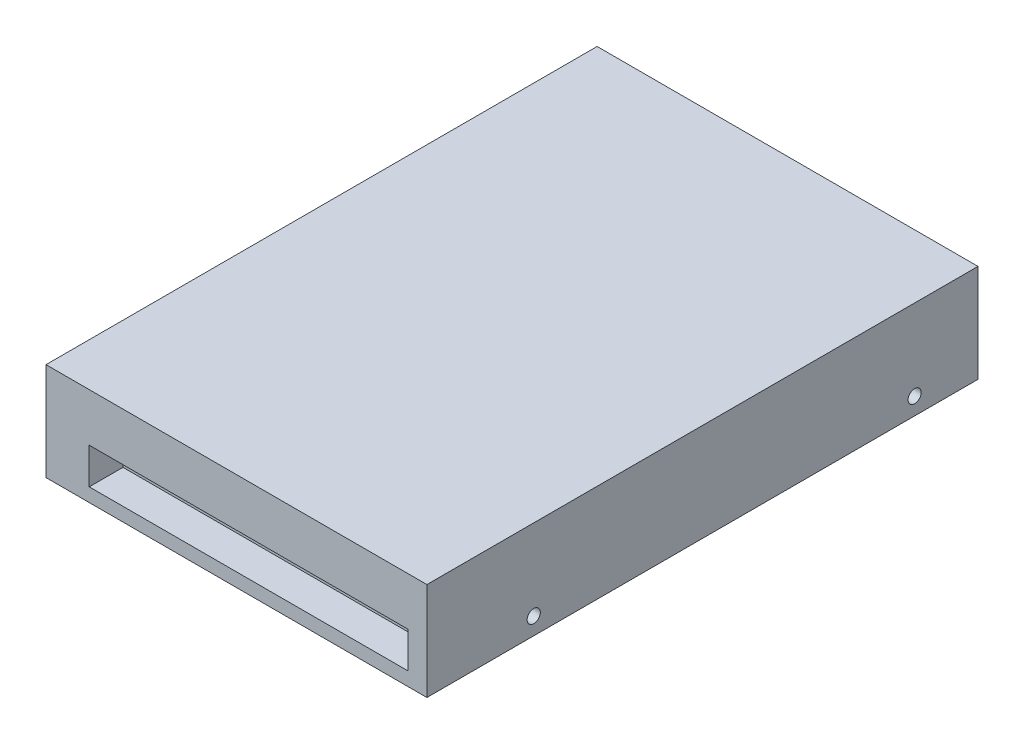
ISO-10303-21;
HEADER;
FILE_DESCRIPTION(('STEP AP214'),'2;1');
FILE_NAME('part.step','',(''),(''),'','','');
FILE_SCHEMA(('AUTOMOTIVE_DESIGN { 1 0 10303 214 1 1 1 1 }'));
ENDSEC;
DATA;
#1=APPLICATION_CONTEXT('core data for automotive mechanical design processes');
#2=APPLICATION_PROTOCOL_DEFINITION('international standard','automotive_design',2000,#1);
#3=PRODUCT_CONTEXT('',#1,'mechanical');
#4=PRODUCT('Part','Part','',(#3));
#5=PRODUCT_RELATED_PRODUCT_CATEGORY('part','',(#4));
#6=PRODUCT_DEFINITION_FORMATION('','',#4);
#7=PRODUCT_DEFINITION_CONTEXT('part definition',#1,'design');
#8=PRODUCT_DEFINITION('design','',#6,#7);
#9=PRODUCT_DEFINITION_SHAPE('','',#8);
#10=(LENGTH_UNIT() NAMED_UNIT(*) SI_UNIT(.MILLI.,.METRE.));
#11=(NAMED_UNIT(*) PLANE_ANGLE_UNIT() SI_UNIT($,.RADIAN.));
#12=(NAMED_UNIT(*) SI_UNIT($,.STERADIAN.) SOLID_ANGLE_UNIT());
#13=UNCERTAINTY_MEASURE_WITH_UNIT(LENGTH_MEASURE(1.E-05),#10,'distance_accuracy_value','');
#14=(GEOMETRIC_REPRESENTATION_CONTEXT(3) GLOBAL_UNCERTAINTY_ASSIGNED_CONTEXT((#13)) GLOBAL_UNIT_ASSIGNED_CONTEXT((#10,
#11,#12)) REPRESENTATION_CONTEXT('',''));
#15=CARTESIAN_POINT('',(0.,0.,0.));
#16=DIRECTION('',(0.,0.,1.));
#17=DIRECTION('',(1.,0.,0.));
#18=AXIS2_PLACEMENT_3D('',#15,#16,#17);
#19=CARTESIAN_POINT('',(50.8,26.1,73.5));
#20=DIRECTION('',(-1.,0.,0.));
#21=DIRECTION('',(0.,0.,1.));
#22=AXIS2_PLACEMENT_3D('',#19,#20,#21);
#23=PLANE('',#22);
#24=CARTESIAN_POINT('',(50.8,4.56739564827879,45.));
#25=DIRECTION('',(-1.,0.,0.));
#26=DIRECTION('',(0.,0.,1.));
#27=AXIS2_PLACEMENT_3D('',#24,#25,#26);
#28=CIRCLE('',#27,1.7526);
#29=CARTESIAN_POINT('',(50.8,4.56739564827879,46.7526));
#30=VERTEX_POINT('',#29);
#31=EDGE_CURVE('E201',#30,#30,#28,.T.);
#32=ORIENTED_EDGE('',*,*,#31,.T.);
#33=EDGE_LOOP('',(#32));
#34=FACE_BOUND('',#33,.T.);
#35=DIRECTION('',(0.,0.,-1.));
#36=VECTOR('',#35,1.);
#37=CARTESIAN_POINT('',(50.8,0.,73.5));
#38=LINE('',#37,#36);
#39=CARTESIAN_POINT('',(50.8,0.,73.5));
#40=VERTEX_POINT('',#39);
#41=CARTESIAN_POINT('',(50.8,0.,-73.5));
#42=VERTEX_POINT('',#41);
#43=EDGE_CURVE('E162',#40,#42,#38,.T.);
#44=ORIENTED_EDGE('',*,*,#43,.T.);
#45=DIRECTION('',(0.,-1.,0.));
#46=VECTOR('',#45,1.);
#47=CARTESIAN_POINT('',(50.8,26.1,-73.5));
#48=LINE('',#47,#46);
#49=CARTESIAN_POINT('',(50.8,26.1,-73.5));
#50=VERTEX_POINT('',#49);
#51=EDGE_CURVE('E166',#50,#42,#48,.T.);
#52=ORIENTED_EDGE('',*,*,#51,.F.);
#53=DIRECTION('',(0.,0.,-1.));
#54=VECTOR('',#53,1.);
#55=CARTESIAN_POINT('',(50.8,26.1,73.5));
#56=LINE('',#55,#54);
#57=CARTESIAN_POINT('',(50.8,26.1,73.5));
#58=VERTEX_POINT('',#57);
#59=EDGE_CURVE('E154',#58,#50,#56,.T.);
#60=ORIENTED_EDGE('',*,*,#59,.F.);
#61=DIRECTION('',(0.,-1.,0.));
#62=VECTOR('',#61,1.);
#63=CARTESIAN_POINT('',(50.8,26.1,73.5));
#64=LINE('',#63,#62);
#65=EDGE_CURVE('E42',#58,#40,#64,.T.);
#66=ORIENTED_EDGE('',*,*,#65,.T.);
#67=EDGE_LOOP('',(#44,#52,#60,#66));
#68=FACE_BOUND('',#67,.T.);
#69=CARTESIAN_POINT('',(50.8,4.56739564827879,-56.6));
#70=DIRECTION('',(-1.,0.,0.));
#71=DIRECTION('',(0.,0.,1.));
#72=AXIS2_PLACEMENT_3D('',#69,#70,#71);
#73=CIRCLE('',#72,1.7526);
#74=CARTESIAN_POINT('',(50.8,4.56739564827879,-54.8474));
#75=VERTEX_POINT('',#74);
#76=EDGE_CURVE('E210',#75,#75,#73,.T.);
#77=ORIENTED_EDGE('',*,*,#76,.T.);
#78=EDGE_LOOP('',(#77));
#79=FACE_BOUND('',#78,.T.);
#80=ADVANCED_FACE('F34',(#34,#68,#79),#23,.F.);
#81=CARTESIAN_POINT('',(-50.8,0.,-73.5));
#82=DIRECTION('',(0.,-1.,0.));
#83=DIRECTION('',(0.,0.,-1.));
#84=AXIS2_PLACEMENT_3D('',#81,#82,#83);
#85=PLANE('',#84);
#86=CARTESIAN_POINT('',(47.62,0.,-12.23));
#87=DIRECTION('',(0.,1.,0.));
#88=DIRECTION('',(0.,0.,-1.));
#89=AXIS2_PLACEMENT_3D('',#86,#87,#88);
#90=CIRCLE('',#89,1.7526);
#91=CARTESIAN_POINT('',(47.62,0.,-13.9826));
#92=VERTEX_POINT('',#91);
#93=EDGE_CURVE('E217',#92,#92,#90,.T.);
#94=ORIENTED_EDGE('',*,*,#93,.T.);
#95=EDGE_LOOP('',(#94));
#96=FACE_BOUND('',#95,.T.);
#97=DIRECTION('',(0.,0.,1.));
#98=VECTOR('',#97,1.);
#99=CARTESIAN_POINT('',(-50.8,0.,73.5));
#100=LINE('',#99,#98);
#101=CARTESIAN_POINT('',(-50.8,0.,-73.5));
#102=VERTEX_POINT('',#101);
#103=CARTESIAN_POINT('',(-50.8,0.,73.5));
#104=VERTEX_POINT('',#103);
#105=EDGE_CURVE('E147',#102,#104,#100,.T.);
#106=ORIENTED_EDGE('',*,*,#105,.F.);
#107=DIRECTION('',(-1.,0.,0.));
#108=VECTOR('',#107,1.);
#109=CARTESIAN_POINT('',(-50.8,0.,-73.5));
#110=LINE('',#109,#108);
#111=EDGE_CURVE('E79',#42,#102,#110,.T.);
#112=ORIENTED_EDGE('',*,*,#111,.F.);
#113=ORIENTED_EDGE('',*,*,#43,.F.);
#114=DIRECTION('',(1.,0.,0.));
#115=VECTOR('',#114,1.);
#116=CARTESIAN_POINT('',(-50.8,0.,73.5));
#117=LINE('',#116,#115);
#118=EDGE_CURVE('E160',#104,#40,#117,.T.);
#119=ORIENTED_EDGE('',*,*,#118,.F.);
#120=EDGE_LOOP('',(#106,#112,#113,#119));
#121=FACE_BOUND('',#120,.T.);
#122=CARTESIAN_POINT('',(-47.62,0.,32.22));
#123=DIRECTION('',(0.,-1.,0.));
#124=DIRECTION('',(0.,0.,-1.));
#125=AXIS2_PLACEMENT_3D('',#122,#123,#124);
#126=CIRCLE('',#125,1.7526);
#127=CARTESIAN_POINT('',(-47.62,0.,30.4674));
#128=VERTEX_POINT('',#127);
#129=EDGE_CURVE('E134',#128,#128,#126,.T.);
#130=ORIENTED_EDGE('',*,*,#129,.F.);
#131=EDGE_LOOP('',(#130));
#132=FACE_BOUND('',#131,.T.);
#133=CARTESIAN_POINT('',(-47.62,0.,-12.23));
#134=DIRECTION('',(0.,-1.,0.));
#135=DIRECTION('',(0.,0.,-1.));
#136=AXIS2_PLACEMENT_3D('',#133,#134,#135);
#137=CIRCLE('',#136,1.7526);
#138=CARTESIAN_POINT('',(-47.62,0.,-13.9826));
#139=VERTEX_POINT('',#138);
#140=EDGE_CURVE('E247',#139,#139,#137,.T.);
#141=ORIENTED_EDGE('',*,*,#140,.F.);
#142=EDGE_LOOP('',(#141));
#143=FACE_BOUND('',#142,.T.);
#144=CARTESIAN_POINT('',(-47.62,0.,-43.98));
#145=DIRECTION('',(0.,-1.,0.));
#146=DIRECTION('',(0.,0.,-1.));
#147=AXIS2_PLACEMENT_3D('',#144,#145,#146);
#148=CIRCLE('',#147,1.7526);
#149=CARTESIAN_POINT('',(-47.62,0.,-45.7326));
#150=VERTEX_POINT('',#149);
#151=EDGE_CURVE('E241',#150,#150,#148,.T.);
#152=ORIENTED_EDGE('',*,*,#151,.F.);
#153=EDGE_LOOP('',(#152));
#154=FACE_BOUND('',#153,.T.);
#155=CARTESIAN_POINT('',(47.62,0.,32.22));
#156=DIRECTION('',(0.,1.,0.));
#157=DIRECTION('',(0.,0.,-1.));
#158=AXIS2_PLACEMENT_3D('',#155,#156,#157);
#159=CIRCLE('',#158,1.7526);
#160=CARTESIAN_POINT('',(47.62,0.,30.4674));
#161=VERTEX_POINT('',#160);
#162=EDGE_CURVE('E223',#161,#161,#159,.T.);
#163=ORIENTED_EDGE('',*,*,#162,.T.);
#164=EDGE_LOOP('',(#163));
#165=FACE_BOUND('',#164,.T.);
#166=CARTESIAN_POINT('',(47.62,0.,-43.98));
#167=DIRECTION('',(0.,1.,0.));
#168=DIRECTION('',(0.,0.,-1.));
#169=AXIS2_PLACEMENT_3D('',#166,#167,#168);
#170=CIRCLE('',#169,1.7526);
#171=CARTESIAN_POINT('',(47.62,0.,-45.7326));
#172=VERTEX_POINT('',#171);
#173=EDGE_CURVE('E207',#172,#172,#170,.T.);
#174=ORIENTED_EDGE('',*,*,#173,.T.);
#175=EDGE_LOOP('',(#174));
#176=FACE_BOUND('',#175,.T.);
#177=ADVANCED_FACE('F175',(#96,#121,#132,#143,#154,#165,#176),#85,.T.);
#178=CARTESIAN_POINT('',(-50.8,26.1,73.5));
#179=DIRECTION('',(1.,0.,0.));
#180=DIRECTION('',(0.,0.,-1.));
#181=AXIS2_PLACEMENT_3D('',#178,#179,#180);
#182=PLANE('',#181);
#183=CARTESIAN_POINT('',(-50.8,4.56739564827879,-56.6));
#184=DIRECTION('',(-1.,0.,0.));
#185=DIRECTION('',(0.,0.,1.));
#186=AXIS2_PLACEMENT_3D('',#183,#184,#185);
#187=CIRCLE('',#186,1.7526);
#188=CARTESIAN_POINT('',(-50.8,4.56739564827879,-54.8474));
#189=VERTEX_POINT('',#188);
#190=EDGE_CURVE('E229',#189,#189,#187,.T.);
#191=ORIENTED_EDGE('',*,*,#190,.F.);
#192=EDGE_LOOP('',(#191));
#193=FACE_BOUND('',#192,.T.);
#194=CARTESIAN_POINT('',(-50.8,4.56739564827879,45.));
#195=DIRECTION('',(-1.,0.,0.));
#196=DIRECTION('',(0.,0.,1.));
#197=AXIS2_PLACEMENT_3D('',#194,#195,#196);
#198=CIRCLE('',#197,1.7526);
#199=CARTESIAN_POINT('',(-50.8,4.56739564827879,46.7526));
#200=VERTEX_POINT('',#199);
#201=EDGE_CURVE('E235',#200,#200,#198,.T.);
#202=ORIENTED_EDGE('',*,*,#201,.F.);
#203=EDGE_LOOP('',(#202));
#204=FACE_BOUND('',#203,.T.);
#205=ORIENTED_EDGE('',*,*,#105,.T.);
#206=DIRECTION('',(0.,-1.,0.));
#207=VECTOR('',#206,1.);
#208=CARTESIAN_POINT('',(-50.8,26.1,73.5));
#209=LINE('',#208,#207);
#210=CARTESIAN_POINT('',(-50.8,26.1,73.5));
#211=VERTEX_POINT('',#210);
#212=EDGE_CURVE('E11',#211,#104,#209,.T.);
#213=ORIENTED_EDGE('',*,*,#212,.F.);
#214=DIRECTION('',(0.,0.,1.));
#215=VECTOR('',#214,1.);
#216=CARTESIAN_POINT('',(-50.8,26.1,73.5));
#217=LINE('',#216,#215);
#218=CARTESIAN_POINT('',(-50.8,26.1,-73.5));
#219=VERTEX_POINT('',#218);
#220=EDGE_CURVE('E151',#219,#211,#217,.T.);
#221=ORIENTED_EDGE('',*,*,#220,.F.);
#222=DIRECTION('',(0.,-1.,0.));
#223=VECTOR('',#222,1.);
#224=CARTESIAN_POINT('',(-50.8,26.1,-73.5));
#225=LINE('',#224,#223);
#226=EDGE_CURVE('E157',#219,#102,#225,.T.);
#227=ORIENTED_EDGE('',*,*,#226,.T.);
#228=EDGE_LOOP('',(#205,#213,#221,#227));
#229=FACE_BOUND('',#228,.T.);
#230=ADVANCED_FACE('F36',(#193,#204,#229),#182,.F.);
#231=CARTESIAN_POINT('',(-50.8,26.1,73.5));
#232=DIRECTION('',(0.,0.,-1.));
#233=DIRECTION('',(-1.,0.,0.));
#234=AXIS2_PLACEMENT_3D('',#231,#232,#233);
#235=PLANE('',#234);
#236=DIRECTION('',(1.,0.,0.));
#237=VECTOR('',#236,1.);
#238=CARTESIAN_POINT('',(-39.268212057209,3.63745397373805,73.5));
#239=LINE('',#238,#237);
#240=CARTESIAN_POINT('',(-39.268212057209,3.63745397373805,73.5));
#241=VERTEX_POINT('',#240);
#242=CARTESIAN_POINT('',(45.7945777667987,3.63745397373805,73.5));
#243=VERTEX_POINT('',#242);
#244=EDGE_CURVE('E140',#241,#243,#239,.T.);
#245=ORIENTED_EDGE('',*,*,#244,.F.);
#246=DIRECTION('',(0.,-1.,0.));
#247=VECTOR('',#246,1.);
#248=CARTESIAN_POINT('',(-39.268212057209,3.63745397373805,73.5));
#249=LINE('',#248,#247);
#250=CARTESIAN_POINT('',(-39.268212057209,13.2595497600505,73.5));
#251=VERTEX_POINT('',#250);
#252=EDGE_CURVE('E49',#251,#241,#249,.T.);
#253=ORIENTED_EDGE('',*,*,#252,.F.);
#254=DIRECTION('',(-1.,0.,0.));
#255=VECTOR('',#254,1.);
#256=CARTESIAN_POINT('',(-39.268212057209,13.2595497600505,73.5));
#257=LINE('',#256,#255);
#258=CARTESIAN_POINT('',(45.7945777667987,13.2595497600505,73.5));
#259=VERTEX_POINT('',#258);
#260=EDGE_CURVE('E128',#259,#251,#257,.T.);
#261=ORIENTED_EDGE('',*,*,#260,.F.);
#262=DIRECTION('',(0.,1.,0.));
#263=VECTOR('',#262,1.);
#264=CARTESIAN_POINT('',(45.7945777667987,3.63745397373805,73.5));
#265=LINE('',#264,#263);
#266=EDGE_CURVE('E131',#243,#259,#265,.T.);
#267=ORIENTED_EDGE('',*,*,#266,.F.);
#268=EDGE_LOOP('',(#245,#253,#261,#267));
#269=FACE_BOUND('',#268,.T.);
#270=ORIENTED_EDGE('',*,*,#118,.T.);
#271=ORIENTED_EDGE('',*,*,#65,.F.);
#272=DIRECTION('',(1.,0.,0.));
#273=VECTOR('',#272,1.);
#274=CARTESIAN_POINT('',(-50.8,26.1,73.5));
#275=LINE('',#274,#273);
#276=EDGE_CURVE('E86',#211,#58,#275,.T.);
#277=ORIENTED_EDGE('',*,*,#276,.F.);
#278=ORIENTED_EDGE('',*,*,#212,.T.);
#279=EDGE_LOOP('',(#270,#271,#277,#278));
#280=FACE_BOUND('',#279,.T.);
#281=ADVANCED_FACE('F183',(#269,#280),#235,.F.);
#282=CARTESIAN_POINT('',(-50.8,26.1,-73.5));
#283=DIRECTION('',(0.,0.,1.));
#284=DIRECTION('',(1.,0.,0.));
#285=AXIS2_PLACEMENT_3D('',#282,#283,#284);
#286=PLANE('',#285);
#287=ORIENTED_EDGE('',*,*,#111,.T.);
#288=ORIENTED_EDGE('',*,*,#226,.F.);
#289=DIRECTION('',(-1.,0.,0.));
#290=VECTOR('',#289,1.);
#291=CARTESIAN_POINT('',(-50.8,26.1,-73.5));
#292=LINE('',#291,#290);
#293=EDGE_CURVE('E58',#50,#219,#292,.T.);
#294=ORIENTED_EDGE('',*,*,#293,.F.);
#295=ORIENTED_EDGE('',*,*,#51,.T.);
#296=EDGE_LOOP('',(#287,#288,#294,#295));
#297=FACE_BOUND('',#296,.T.);
#298=ADVANCED_FACE('F180',(#297),#286,.F.);
#299=CARTESIAN_POINT('',(-50.8,26.1,-73.5));
#300=DIRECTION('',(0.,-1.,0.));
#301=DIRECTION('',(0.,0.,-1.));
#302=AXIS2_PLACEMENT_3D('',#299,#300,#301);
#303=PLANE('',#302);
#304=ORIENTED_EDGE('',*,*,#220,.T.);
#305=ORIENTED_EDGE('',*,*,#276,.T.);
#306=ORIENTED_EDGE('',*,*,#59,.T.);
#307=ORIENTED_EDGE('',*,*,#293,.T.);
#308=EDGE_LOOP('',(#304,#305,#306,#307));
#309=FACE_BOUND('',#308,.T.);
#310=ADVANCED_FACE('F182',(#309),#303,.F.);
#311=CARTESIAN_POINT('',(-39.268212057209,3.63745397373805,64.5));
#312=DIRECTION('',(-1.,0.,0.));
#313=DIRECTION('',(0.,0.,1.));
#314=AXIS2_PLACEMENT_3D('',#311,#312,#313);
#315=PLANE('',#314);
#316=ORIENTED_EDGE('',*,*,#252,.T.);
#317=DIRECTION('',(0.,0.,1.));
#318=VECTOR('',#317,1.);
#319=CARTESIAN_POINT('',(-39.268212057209,3.63745397373805,64.5));
#320=LINE('',#319,#318);
#321=CARTESIAN_POINT('',(-39.268212057209,3.63745397373805,64.5));
#322=VERTEX_POINT('',#321);
#323=EDGE_CURVE('E106',#322,#241,#320,.T.);
#324=ORIENTED_EDGE('',*,*,#323,.F.);
#325=DIRECTION('',(0.,-1.,0.));
#326=VECTOR('',#325,1.);
#327=CARTESIAN_POINT('',(-39.268212057209,3.63745397373805,64.5));
#328=LINE('',#327,#326);
#329=CARTESIAN_POINT('',(-39.268212057209,13.2595497600505,64.5));
#330=VERTEX_POINT('',#329);
#331=EDGE_CURVE('E110',#330,#322,#328,.T.);
#332=ORIENTED_EDGE('',*,*,#331,.F.);
#333=DIRECTION('',(0.,0.,1.));
#334=VECTOR('',#333,1.);
#335=CARTESIAN_POINT('',(-39.268212057209,13.2595497600505,64.5));
#336=LINE('',#335,#334);
#337=EDGE_CURVE('E145',#330,#251,#336,.T.);
#338=ORIENTED_EDGE('',*,*,#337,.T.);
#339=EDGE_LOOP('',(#316,#324,#332,#338));
#340=FACE_BOUND('',#339,.T.);
#341=ADVANCED_FACE('F108',(#340),#315,.F.);
#342=CARTESIAN_POINT('',(-39.268212057209,13.2595497600505,64.5));
#343=DIRECTION('',(0.,1.,0.));
#344=DIRECTION('',(0.,0.,1.));
#345=AXIS2_PLACEMENT_3D('',#342,#343,#344);
#346=PLANE('',#345);
#347=ORIENTED_EDGE('',*,*,#260,.T.);
#348=ORIENTED_EDGE('',*,*,#337,.F.);
#349=DIRECTION('',(-1.,0.,0.));
#350=VECTOR('',#349,1.);
#351=CARTESIAN_POINT('',(-39.268212057209,13.2595497600505,64.5));
#352=LINE('',#351,#350);
#353=CARTESIAN_POINT('',(45.7945777667987,13.2595497600505,64.5));
#354=VERTEX_POINT('',#353);
#355=EDGE_CURVE('E116',#354,#330,#352,.T.);
#356=ORIENTED_EDGE('',*,*,#355,.F.);
#357=DIRECTION('',(0.,0.,1.));
#358=VECTOR('',#357,1.);
#359=CARTESIAN_POINT('',(45.7945777667987,13.2595497600505,64.5));
#360=LINE('',#359,#358);
#361=EDGE_CURVE('E148',#354,#259,#360,.T.);
#362=ORIENTED_EDGE('',*,*,#361,.T.);
#363=EDGE_LOOP('',(#347,#348,#356,#362));
#364=FACE_BOUND('',#363,.T.);
#365=ADVANCED_FACE('F339',(#364),#346,.F.);
#366=CARTESIAN_POINT('',(45.7945777667987,3.63745397373805,64.5));
#367=DIRECTION('',(1.,0.,0.));
#368=DIRECTION('',(0.,0.,-1.));
#369=AXIS2_PLACEMENT_3D('',#366,#367,#368);
#370=PLANE('',#369);
#371=ORIENTED_EDGE('',*,*,#266,.T.);
#372=ORIENTED_EDGE('',*,*,#361,.F.);
#373=DIRECTION('',(0.,1.,0.));
#374=VECTOR('',#373,1.);
#375=CARTESIAN_POINT('',(45.7945777667987,3.63745397373805,64.5));
#376=LINE('',#375,#374);
#377=CARTESIAN_POINT('',(45.7945777667987,3.63745397373805,64.5));
#378=VERTEX_POINT('',#377);
#379=EDGE_CURVE('E124',#378,#354,#376,.T.);
#380=ORIENTED_EDGE('',*,*,#379,.F.);
#381=DIRECTION('',(0.,0.,1.));
#382=VECTOR('',#381,1.);
#383=CARTESIAN_POINT('',(45.7945777667987,3.63745397373805,64.5));
#384=LINE('',#383,#382);
#385=EDGE_CURVE('E115',#378,#243,#384,.T.);
#386=ORIENTED_EDGE('',*,*,#385,.T.);
#387=EDGE_LOOP('',(#371,#372,#380,#386));
#388=FACE_BOUND('',#387,.T.);
#389=ADVANCED_FACE('F342',(#388),#370,.F.);
#390=CARTESIAN_POINT('',(-39.268212057209,3.63745397373805,64.5));
#391=DIRECTION('',(0.,-1.,0.));
#392=DIRECTION('',(0.,0.,-1.));
#393=AXIS2_PLACEMENT_3D('',#390,#391,#392);
#394=PLANE('',#393);
#395=ORIENTED_EDGE('',*,*,#244,.T.);
#396=ORIENTED_EDGE('',*,*,#385,.F.);
#397=DIRECTION('',(1.,0.,0.));
#398=VECTOR('',#397,1.);
#399=CARTESIAN_POINT('',(-39.268212057209,3.63745397373805,64.5));
#400=LINE('',#399,#398);
#401=EDGE_CURVE('E119',#322,#378,#400,.T.);
#402=ORIENTED_EDGE('',*,*,#401,.F.);
#403=ORIENTED_EDGE('',*,*,#323,.T.);
#404=EDGE_LOOP('',(#395,#396,#402,#403));
#405=FACE_BOUND('',#404,.T.);
#406=ADVANCED_FACE('F120',(#405),#394,.F.);
#407=CARTESIAN_POINT('',(-39.268212057209,13.2595497600505,64.5));
#408=DIRECTION('',(0.,0.,-1.));
#409=DIRECTION('',(-1.,0.,0.));
#410=AXIS2_PLACEMENT_3D('',#407,#408,#409);
#411=PLANE('',#410);
#412=ORIENTED_EDGE('',*,*,#331,.T.);
#413=ORIENTED_EDGE('',*,*,#401,.T.);
#414=ORIENTED_EDGE('',*,*,#379,.T.);
#415=ORIENTED_EDGE('',*,*,#355,.T.);
#416=EDGE_LOOP('',(#412,#413,#414,#415));
#417=FACE_BOUND('',#416,.T.);
#418=ADVANCED_FACE('F126',(#417),#411,.F.);
#419=CARTESIAN_POINT('',(-47.62,5.,32.22));
#420=DIRECTION('',(0.,-1.,0.));
#421=DIRECTION('',(0.,0.,-1.));
#422=AXIS2_PLACEMENT_3D('',#419,#420,#421);
#423=CYLINDRICAL_SURFACE('',#422,1.7526);
#424=CARTESIAN_POINT('',(-47.62,5.,32.22));
#425=DIRECTION('',(0.,-1.,0.));
#426=DIRECTION('',(0.,0.,-1.));
#427=AXIS2_PLACEMENT_3D('',#424,#425,#426);
#428=CIRCLE('',#427,1.7526);
#429=CARTESIAN_POINT('',(-47.62,5.,30.4674));
#430=VERTEX_POINT('',#429);
#431=EDGE_CURVE('E141',#430,#430,#428,.T.);
#432=ORIENTED_EDGE('',*,*,#431,.F.);
#433=EDGE_LOOP('',(#432));
#434=FACE_BOUND('',#433,.T.);
#435=ORIENTED_EDGE('',*,*,#129,.T.);
#436=EDGE_LOOP('',(#435));
#437=FACE_BOUND('',#436,.T.);
#438=ADVANCED_FACE('F260',(#434,#437),#423,.F.);
#439=CARTESIAN_POINT('',(-47.62,5.,32.22));
#440=DIRECTION('',(0.,-1.,0.));
#441=DIRECTION('',(0.,0.,-1.));
#442=AXIS2_PLACEMENT_3D('',#439,#440,#441);
#443=PLANE('',#442);
#444=ORIENTED_EDGE('',*,*,#431,.T.);
#445=EDGE_LOOP('',(#444));
#446=FACE_BOUND('',#445,.T.);
#447=ADVANCED_FACE('F330',(#446),#443,.T.);
#448=CARTESIAN_POINT('',(-47.62,5.,-12.23));
#449=DIRECTION('',(0.,-1.,0.));
#450=DIRECTION('',(0.,0.,-1.));
#451=AXIS2_PLACEMENT_3D('',#448,#449,#450);
#452=CYLINDRICAL_SURFACE('',#451,1.7526);
#453=CARTESIAN_POINT('',(-47.62,5.,-12.23));
#454=DIRECTION('',(0.,-1.,0.));
#455=DIRECTION('',(0.,0.,-1.));
#456=AXIS2_PLACEMENT_3D('',#453,#454,#455);
#457=CIRCLE('',#456,1.7526);
#458=CARTESIAN_POINT('',(-47.62,5.,-13.9826));
#459=VERTEX_POINT('',#458);
#460=EDGE_CURVE('E250',#459,#459,#457,.T.);
#461=ORIENTED_EDGE('',*,*,#460,.F.);
#462=EDGE_LOOP('',(#461));
#463=FACE_BOUND('',#462,.T.);
#464=ORIENTED_EDGE('',*,*,#140,.T.);
#465=EDGE_LOOP('',(#464));
#466=FACE_BOUND('',#465,.T.);
#467=ADVANCED_FACE('F326',(#463,#466),#452,.F.);
#468=CARTESIAN_POINT('',(-47.62,5.,-12.23));
#469=DIRECTION('',(0.,-1.,0.));
#470=DIRECTION('',(0.,0.,-1.));
#471=AXIS2_PLACEMENT_3D('',#468,#469,#470);
#472=PLANE('',#471);
#473=ORIENTED_EDGE('',*,*,#460,.T.);
#474=EDGE_LOOP('',(#473));
#475=FACE_BOUND('',#474,.T.);
#476=ADVANCED_FACE('F322',(#475),#472,.T.);
#477=CARTESIAN_POINT('',(-47.62,5.,-43.98));
#478=DIRECTION('',(0.,-1.,0.));
#479=DIRECTION('',(0.,0.,-1.));
#480=AXIS2_PLACEMENT_3D('',#477,#478,#479);
#481=CYLINDRICAL_SURFACE('',#480,1.7526);
#482=CARTESIAN_POINT('',(-47.62,5.,-43.98));
#483=DIRECTION('',(0.,-1.,0.));
#484=DIRECTION('',(0.,0.,-1.));
#485=AXIS2_PLACEMENT_3D('',#482,#483,#484);
#486=CIRCLE('',#485,1.7526);
#487=CARTESIAN_POINT('',(-47.62,5.,-45.7326));
#488=VERTEX_POINT('',#487);
#489=EDGE_CURVE('E244',#488,#488,#486,.T.);
#490=ORIENTED_EDGE('',*,*,#489,.F.);
#491=EDGE_LOOP('',(#490));
#492=FACE_BOUND('',#491,.T.);
#493=ORIENTED_EDGE('',*,*,#151,.T.);
#494=EDGE_LOOP('',(#493));
#495=FACE_BOUND('',#494,.T.);
#496=ADVANCED_FACE('F318',(#492,#495),#481,.F.);
#497=CARTESIAN_POINT('',(-47.62,5.,-43.98));
#498=DIRECTION('',(0.,-1.,0.));
#499=DIRECTION('',(0.,0.,-1.));
#500=AXIS2_PLACEMENT_3D('',#497,#498,#499);
#501=PLANE('',#500);
#502=ORIENTED_EDGE('',*,*,#489,.T.);
#503=EDGE_LOOP('',(#502));
#504=FACE_BOUND('',#503,.T.);
#505=ADVANCED_FACE('F314',(#504),#501,.T.);
#506=CARTESIAN_POINT('',(-45.8,4.56739564827879,45.));
#507=DIRECTION('',(-1.,0.,0.));
#508=DIRECTION('',(0.,0.,1.));
#509=AXIS2_PLACEMENT_3D('',#506,#507,#508);
#510=CYLINDRICAL_SURFACE('',#509,1.7526);
#511=CARTESIAN_POINT('',(-45.8,4.56739564827879,45.));
#512=DIRECTION('',(-1.,0.,0.));
#513=DIRECTION('',(0.,0.,1.));
#514=AXIS2_PLACEMENT_3D('',#511,#512,#513);
#515=CIRCLE('',#514,1.7526);
#516=CARTESIAN_POINT('',(-45.8,4.56739564827879,46.7526));
#517=VERTEX_POINT('',#516);
#518=EDGE_CURVE('E238',#517,#517,#515,.T.);
#519=ORIENTED_EDGE('',*,*,#518,.F.);
#520=EDGE_LOOP('',(#519));
#521=FACE_BOUND('',#520,.T.);
#522=ORIENTED_EDGE('',*,*,#201,.T.);
#523=EDGE_LOOP('',(#522));
#524=FACE_BOUND('',#523,.T.);
#525=ADVANCED_FACE('F310',(#521,#524),#510,.F.);
#526=CARTESIAN_POINT('',(-45.8,4.56739564827879,45.));
#527=DIRECTION('',(-1.,0.,0.));
#528=DIRECTION('',(0.,0.,1.));
#529=AXIS2_PLACEMENT_3D('',#526,#527,#528);
#530=PLANE('',#529);
#531=ORIENTED_EDGE('',*,*,#518,.T.);
#532=EDGE_LOOP('',(#531));
#533=FACE_BOUND('',#532,.T.);
#534=ADVANCED_FACE('F306',(#533),#530,.T.);
#535=CARTESIAN_POINT('',(-45.8,4.56739564827879,-56.6));
#536=DIRECTION('',(-1.,0.,0.));
#537=DIRECTION('',(0.,0.,1.));
#538=AXIS2_PLACEMENT_3D('',#535,#536,#537);
#539=CYLINDRICAL_SURFACE('',#538,1.7526);
#540=CARTESIAN_POINT('',(-45.8,4.56739564827879,-56.6));
#541=DIRECTION('',(-1.,0.,0.));
#542=DIRECTION('',(0.,0.,1.));
#543=AXIS2_PLACEMENT_3D('',#540,#541,#542);
#544=CIRCLE('',#543,1.7526);
#545=CARTESIAN_POINT('',(-45.8,4.56739564827879,-54.8474));
#546=VERTEX_POINT('',#545);
#547=EDGE_CURVE('E232',#546,#546,#544,.T.);
#548=ORIENTED_EDGE('',*,*,#547,.F.);
#549=EDGE_LOOP('',(#548));
#550=FACE_BOUND('',#549,.T.);
#551=ORIENTED_EDGE('',*,*,#190,.T.);
#552=EDGE_LOOP('',(#551));
#553=FACE_BOUND('',#552,.T.);
#554=ADVANCED_FACE('F302',(#550,#553),#539,.F.);
#555=CARTESIAN_POINT('',(-45.8,4.56739564827879,-56.6));
#556=DIRECTION('',(-1.,0.,0.));
#557=DIRECTION('',(0.,0.,1.));
#558=AXIS2_PLACEMENT_3D('',#555,#556,#557);
#559=PLANE('',#558);
#560=ORIENTED_EDGE('',*,*,#547,.T.);
#561=EDGE_LOOP('',(#560));
#562=FACE_BOUND('',#561,.T.);
#563=ADVANCED_FACE('F298',(#562),#559,.T.);
#564=CARTESIAN_POINT('',(47.62,5.,32.22));
#565=DIRECTION('',(0.,-1.,0.));
#566=DIRECTION('',(0.,0.,-1.));
#567=AXIS2_PLACEMENT_3D('',#564,#565,#566);
#568=CYLINDRICAL_SURFACE('',#567,1.7526);
#569=CARTESIAN_POINT('',(47.62,5.,32.22));
#570=DIRECTION('',(0.,1.,0.));
#571=DIRECTION('',(0.,0.,-1.));
#572=AXIS2_PLACEMENT_3D('',#569,#570,#571);
#573=CIRCLE('',#572,1.7526);
#574=CARTESIAN_POINT('',(47.62,5.,30.4674));
#575=VERTEX_POINT('',#574);
#576=EDGE_CURVE('E226',#575,#575,#573,.T.);
#577=ORIENTED_EDGE('',*,*,#576,.T.);
#578=EDGE_LOOP('',(#577));
#579=FACE_BOUND('',#578,.T.);
#580=ORIENTED_EDGE('',*,*,#162,.F.);
#581=EDGE_LOOP('',(#580));
#582=FACE_BOUND('',#581,.T.);
#583=ADVANCED_FACE('F294',(#579,#582),#568,.F.);
#584=CARTESIAN_POINT('',(47.62,5.,32.22));
#585=DIRECTION('',(0.,-1.,0.));
#586=DIRECTION('',(0.,0.,-1.));
#587=AXIS2_PLACEMENT_3D('',#584,#585,#586);
#588=PLANE('',#587);
#589=ORIENTED_EDGE('',*,*,#576,.F.);
#590=EDGE_LOOP('',(#589));
#591=FACE_BOUND('',#590,.T.);
#592=ADVANCED_FACE('F290',(#591),#588,.T.);
#593=CARTESIAN_POINT('',(47.62,5.,-12.23));
#594=DIRECTION('',(0.,-1.,0.));
#595=DIRECTION('',(0.,0.,-1.));
#596=AXIS2_PLACEMENT_3D('',#593,#594,#595);
#597=CYLINDRICAL_SURFACE('',#596,1.7526);
#598=CARTESIAN_POINT('',(47.62,5.,-12.23));
#599=DIRECTION('',(0.,1.,0.));
#600=DIRECTION('',(0.,0.,-1.));
#601=AXIS2_PLACEMENT_3D('',#598,#599,#600);
#602=CIRCLE('',#601,1.7526);
#603=CARTESIAN_POINT('',(47.62,5.,-13.9826));
#604=VERTEX_POINT('',#603);
#605=EDGE_CURVE('E220',#604,#604,#602,.T.);
#606=ORIENTED_EDGE('',*,*,#605,.T.);
#607=EDGE_LOOP('',(#606));
#608=FACE_BOUND('',#607,.T.);
#609=ORIENTED_EDGE('',*,*,#93,.F.);
#610=EDGE_LOOP('',(#609));
#611=FACE_BOUND('',#610,.T.);
#612=ADVANCED_FACE('F283',(#608,#611),#597,.F.);
#613=CARTESIAN_POINT('',(47.62,5.,-12.23));
#614=DIRECTION('',(0.,-1.,0.));
#615=DIRECTION('',(0.,0.,-1.));
#616=AXIS2_PLACEMENT_3D('',#613,#614,#615);
#617=PLANE('',#616);
#618=ORIENTED_EDGE('',*,*,#605,.F.);
#619=EDGE_LOOP('',(#618));
#620=FACE_BOUND('',#619,.T.);
#621=ADVANCED_FACE('F273',(#620),#617,.T.);
#622=CARTESIAN_POINT('',(47.62,5.,-43.98));
#623=DIRECTION('',(0.,-1.,0.));
#624=DIRECTION('',(0.,0.,-1.));
#625=AXIS2_PLACEMENT_3D('',#622,#623,#624);
#626=CYLINDRICAL_SURFACE('',#625,1.7526);
#627=CARTESIAN_POINT('',(47.62,5.,-43.98));
#628=DIRECTION('',(0.,1.,0.));
#629=DIRECTION('',(0.,0.,-1.));
#630=AXIS2_PLACEMENT_3D('',#627,#628,#629);
#631=CIRCLE('',#630,1.7526);
#632=CARTESIAN_POINT('',(47.62,5.,-45.7326));
#633=VERTEX_POINT('',#632);
#634=EDGE_CURVE('E214',#633,#633,#631,.T.);
#635=ORIENTED_EDGE('',*,*,#634,.T.);
#636=EDGE_LOOP('',(#635));
#637=FACE_BOUND('',#636,.T.);
#638=ORIENTED_EDGE('',*,*,#173,.F.);
#639=EDGE_LOOP('',(#638));
#640=FACE_BOUND('',#639,.T.);
#641=ADVANCED_FACE('F270',(#637,#640),#626,.F.);
#642=CARTESIAN_POINT('',(47.62,5.,-43.98));
#643=DIRECTION('',(0.,-1.,0.));
#644=DIRECTION('',(0.,0.,-1.));
#645=AXIS2_PLACEMENT_3D('',#642,#643,#644);
#646=PLANE('',#645);
#647=ORIENTED_EDGE('',*,*,#634,.F.);
#648=EDGE_LOOP('',(#647));
#649=FACE_BOUND('',#648,.T.);
#650=ADVANCED_FACE('F272',(#649),#646,.T.);
#651=CARTESIAN_POINT('',(45.8,4.56739564827879,45.));
#652=DIRECTION('',(1.,0.,0.));
#653=DIRECTION('',(0.,0.,-1.));
#654=AXIS2_PLACEMENT_3D('',#651,#652,#653);
#655=CYLINDRICAL_SURFACE('',#654,1.7526);
#656=CARTESIAN_POINT('',(45.8,4.56739564827879,45.));
#657=DIRECTION('',(-1.,0.,0.));
#658=DIRECTION('',(0.,0.,1.));
#659=AXIS2_PLACEMENT_3D('',#656,#657,#658);
#660=CIRCLE('',#659,1.7526);
#661=CARTESIAN_POINT('',(45.8,4.56739564827879,46.7526));
#662=VERTEX_POINT('',#661);
#663=EDGE_CURVE('E203',#662,#662,#660,.T.);
#664=ORIENTED_EDGE('',*,*,#663,.T.);
#665=EDGE_LOOP('',(#664));
#666=FACE_BOUND('',#665,.T.);
#667=ORIENTED_EDGE('',*,*,#31,.F.);
#668=EDGE_LOOP('',(#667));
#669=FACE_BOUND('',#668,.T.);
#670=ADVANCED_FACE('F280',(#666,#669),#655,.F.);
#671=CARTESIAN_POINT('',(45.8,4.56739564827879,45.));
#672=DIRECTION('',(1.,0.,0.));
#673=DIRECTION('',(0.,0.,1.));
#674=AXIS2_PLACEMENT_3D('',#671,#672,#673);
#675=PLANE('',#674);
#676=ORIENTED_EDGE('',*,*,#663,.F.);
#677=EDGE_LOOP('',(#676));
#678=FACE_BOUND('',#677,.T.);
#679=ADVANCED_FACE('F449',(#678),#675,.T.);
#680=CARTESIAN_POINT('',(45.8,4.56739564827879,-56.6));
#681=DIRECTION('',(1.,0.,0.));
#682=DIRECTION('',(0.,0.,-1.));
#683=AXIS2_PLACEMENT_3D('',#680,#681,#682);
#684=CYLINDRICAL_SURFACE('',#683,1.7526);
#685=CARTESIAN_POINT('',(45.8,4.56739564827879,-56.6));
#686=DIRECTION('',(-1.,0.,0.));
#687=DIRECTION('',(0.,0.,1.));
#688=AXIS2_PLACEMENT_3D('',#685,#686,#687);
#689=CIRCLE('',#688,1.7526);
#690=CARTESIAN_POINT('',(45.8,4.56739564827879,-54.8474));
#691=VERTEX_POINT('',#690);
#692=EDGE_CURVE('E204',#691,#691,#689,.T.);
#693=ORIENTED_EDGE('',*,*,#692,.T.);
#694=EDGE_LOOP('',(#693));
#695=FACE_BOUND('',#694,.T.);
#696=ORIENTED_EDGE('',*,*,#76,.F.);
#697=EDGE_LOOP('',(#696));
#698=FACE_BOUND('',#697,.T.);
#699=ADVANCED_FACE('F458',(#695,#698),#684,.F.);
#700=CARTESIAN_POINT('',(45.8,4.56739564827879,-56.6));
#701=DIRECTION('',(1.,0.,0.));
#702=DIRECTION('',(0.,0.,1.));
#703=AXIS2_PLACEMENT_3D('',#700,#701,#702);
#704=PLANE('',#703);
#705=ORIENTED_EDGE('',*,*,#692,.F.);
#706=EDGE_LOOP('',(#705));
#707=FACE_BOUND('',#706,.T.);
#708=ADVANCED_FACE('F468',(#707),#704,.T.);
#709=CLOSED_SHELL('',(#80,#177,#230,#281,#298,#310,#341,#365,#389,#406,#418,#438,#447,#467,#476,
#496,#505,#525,#534,#554,#563,#583,#592,#612,#621,#641,#650,#670,#679,#699,#708));
#710=MANIFOLD_SOLID_BREP('B2',#709);
#711=ADVANCED_BREP_SHAPE_REPRESENTATION('',(#18,#710),#14);
#712=SHAPE_DEFINITION_REPRESENTATION(#9,#711);
ENDSEC;
END-ISO-10303-21;
